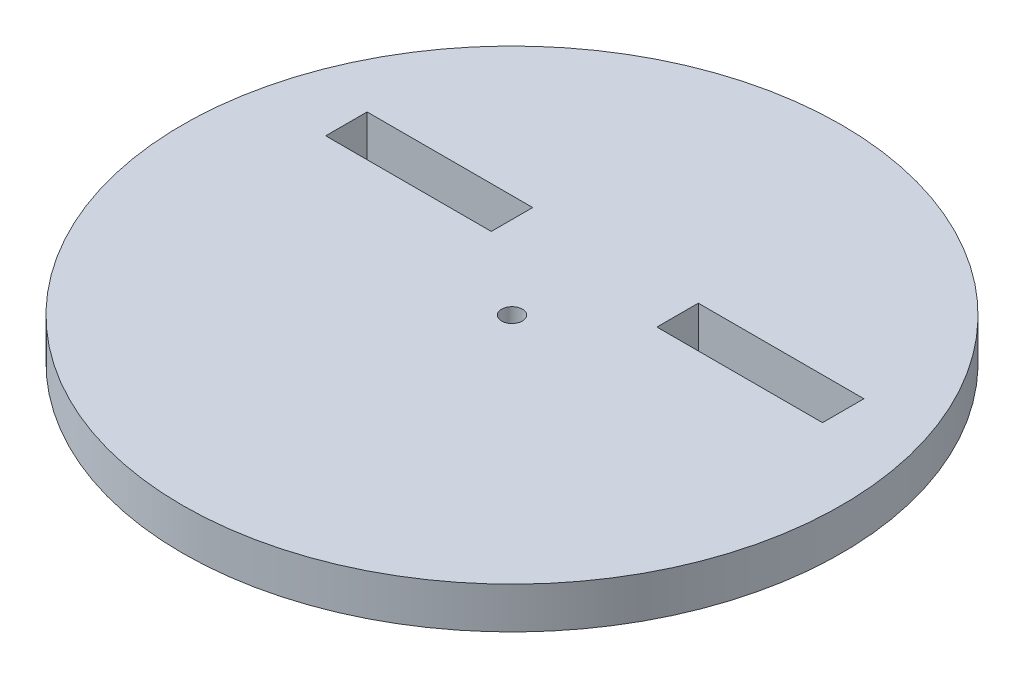
ISO-10303-21;
HEADER;
FILE_DESCRIPTION(('STEP AP214'),'2;1');
FILE_NAME('part.step','',(''),(''),'','','');
FILE_SCHEMA(('AUTOMOTIVE_DESIGN { 1 0 10303 214 1 1 1 1 }'));
ENDSEC;
DATA;
#1=APPLICATION_CONTEXT('core data for automotive mechanical design processes');
#2=APPLICATION_PROTOCOL_DEFINITION('international standard','automotive_design',2000,#1);
#3=PRODUCT_CONTEXT('',#1,'mechanical');
#4=PRODUCT('Part','Part','',(#3));
#5=PRODUCT_RELATED_PRODUCT_CATEGORY('part','',(#4));
#6=PRODUCT_DEFINITION_FORMATION('','',#4);
#7=PRODUCT_DEFINITION_CONTEXT('part definition',#1,'design');
#8=PRODUCT_DEFINITION('design','',#6,#7);
#9=PRODUCT_DEFINITION_SHAPE('','',#8);
#10=(LENGTH_UNIT() NAMED_UNIT(*) SI_UNIT(.MILLI.,.METRE.));
#11=(NAMED_UNIT(*) PLANE_ANGLE_UNIT() SI_UNIT($,.RADIAN.));
#12=(NAMED_UNIT(*) SI_UNIT($,.STERADIAN.) SOLID_ANGLE_UNIT());
#13=UNCERTAINTY_MEASURE_WITH_UNIT(LENGTH_MEASURE(1.E-05),#10,'distance_accuracy_value','');
#14=(GEOMETRIC_REPRESENTATION_CONTEXT(3) GLOBAL_UNCERTAINTY_ASSIGNED_CONTEXT((#13)) GLOBAL_UNIT_ASSIGNED_CONTEXT((#10,
#11,#12)) REPRESENTATION_CONTEXT('',''));
#15=CARTESIAN_POINT('',(0.,0.,0.));
#16=DIRECTION('',(0.,0.,1.));
#17=DIRECTION('',(1.,0.,0.));
#18=AXIS2_PLACEMENT_3D('',#15,#16,#17);
#19=CARTESIAN_POINT('',(0.,6.35,0.));
#20=DIRECTION('',(0.,1.,0.));
#21=DIRECTION('',(0.,0.,1.));
#22=AXIS2_PLACEMENT_3D('',#19,#20,#21);
#23=PLANE('',#22);
#24=CARTESIAN_POINT('',(0.,6.35,0.));
#25=DIRECTION('',(0.,1.,0.));
#26=DIRECTION('',(0.,0.,1.));
#27=AXIS2_PLACEMENT_3D('',#24,#25,#26);
#28=CIRCLE('',#27,50.546);
#29=CARTESIAN_POINT('',(0.,6.35,50.546));
#30=VERTEX_POINT('',#29);
#31=EDGE_CURVE('E11',#30,#30,#28,.T.);
#32=ORIENTED_EDGE('',*,*,#31,.T.);
#33=EDGE_LOOP('',(#32));
#34=FACE_BOUND('',#33,.T.);
#35=CARTESIAN_POINT('',(0.,6.35,0.));
#36=DIRECTION('',(0.,1.,0.));
#37=DIRECTION('',(0.,0.,1.));
#38=AXIS2_PLACEMENT_3D('',#35,#36,#37);
#39=CIRCLE('',#38,1.5875);
#40=CARTESIAN_POINT('',(0.,6.35,1.5875));
#41=VERTEX_POINT('',#40);
#42=EDGE_CURVE('E196',#41,#41,#39,.T.);
#43=ORIENTED_EDGE('',*,*,#42,.F.);
#44=EDGE_LOOP('',(#43));
#45=FACE_BOUND('',#44,.T.);
#46=DIRECTION('',(-1.,0.,0.));
#47=VECTOR('',#46,1.);
#48=CARTESIAN_POINT('',(-38.1,6.35,-15.875));
#49=LINE('',#48,#47);
#50=CARTESIAN_POINT('',(-12.7,6.35,-15.875));
#51=VERTEX_POINT('',#50);
#52=CARTESIAN_POINT('',(-38.1,6.35,-15.875));
#53=VERTEX_POINT('',#52);
#54=EDGE_CURVE('E156',#51,#53,#49,.T.);
#55=ORIENTED_EDGE('',*,*,#54,.F.);
#56=DIRECTION('',(0.,0.,-1.));
#57=VECTOR('',#56,1.);
#58=CARTESIAN_POINT('',(-12.7,6.35,-15.875));
#59=LINE('',#58,#57);
#60=CARTESIAN_POINT('',(-12.7,6.35,-9.525));
#61=VERTEX_POINT('',#60);
#62=EDGE_CURVE('E153',#61,#51,#59,.T.);
#63=ORIENTED_EDGE('',*,*,#62,.F.);
#64=DIRECTION('',(1.,0.,0.));
#65=VECTOR('',#64,1.);
#66=CARTESIAN_POINT('',(-38.1,6.35,-9.525));
#67=LINE('',#66,#65);
#68=CARTESIAN_POINT('',(-38.1,6.35,-9.525));
#69=VERTEX_POINT('',#68);
#70=EDGE_CURVE('E164',#69,#61,#67,.T.);
#71=ORIENTED_EDGE('',*,*,#70,.F.);
#72=DIRECTION('',(0.,0.,1.));
#73=VECTOR('',#72,1.);
#74=CARTESIAN_POINT('',(-38.1,6.35,-15.875));
#75=LINE('',#74,#73);
#76=EDGE_CURVE('E160',#53,#69,#75,.T.);
#77=ORIENTED_EDGE('',*,*,#76,.F.);
#78=EDGE_LOOP('',(#55,#63,#71,#77));
#79=FACE_BOUND('',#78,.T.);
#80=DIRECTION('',(0.,0.,1.));
#81=VECTOR('',#80,1.);
#82=CARTESIAN_POINT('',(12.7,6.35,-15.875));
#83=LINE('',#82,#81);
#84=CARTESIAN_POINT('',(12.7,6.35,-15.875));
#85=VERTEX_POINT('',#84);
#86=CARTESIAN_POINT('',(12.7,6.35,-9.525));
#87=VERTEX_POINT('',#86);
#88=EDGE_CURVE('E114',#85,#87,#83,.T.);
#89=ORIENTED_EDGE('',*,*,#88,.F.);
#90=DIRECTION('',(-1.,0.,0.));
#91=VECTOR('',#90,1.);
#92=CARTESIAN_POINT('',(38.1,6.35,-15.875));
#93=LINE('',#92,#91);
#94=CARTESIAN_POINT('',(38.1,6.35,-15.875));
#95=VERTEX_POINT('',#94);
#96=EDGE_CURVE('E105',#95,#85,#93,.T.);
#97=ORIENTED_EDGE('',*,*,#96,.F.);
#98=DIRECTION('',(0.,0.,-1.));
#99=VECTOR('',#98,1.);
#100=CARTESIAN_POINT('',(38.1,6.35,-15.875));
#101=LINE('',#100,#99);
#102=CARTESIAN_POINT('',(38.1,6.35,-9.525));
#103=VERTEX_POINT('',#102);
#104=EDGE_CURVE('E131',#103,#95,#101,.T.);
#105=ORIENTED_EDGE('',*,*,#104,.F.);
#106=DIRECTION('',(1.,0.,0.));
#107=VECTOR('',#106,1.);
#108=CARTESIAN_POINT('',(38.1,6.35,-9.525));
#109=LINE('',#108,#107);
#110=EDGE_CURVE('E127',#87,#103,#109,.T.);
#111=ORIENTED_EDGE('',*,*,#110,.F.);
#112=EDGE_LOOP('',(#89,#97,#105,#111));
#113=FACE_BOUND('',#112,.T.);
#114=ADVANCED_FACE('F39',(#34,#45,#79,#113),#23,.T.);
#115=CARTESIAN_POINT('',(0.,0.,0.));
#116=DIRECTION('',(0.,1.,0.));
#117=DIRECTION('',(0.,0.,1.));
#118=AXIS2_PLACEMENT_3D('',#115,#116,#117);
#119=PLANE('',#118);
#120=DIRECTION('',(0.,0.,-1.));
#121=VECTOR('',#120,1.);
#122=CARTESIAN_POINT('',(-12.7,0.,-15.875));
#123=LINE('',#122,#121);
#124=CARTESIAN_POINT('',(-12.7,0.,-9.525));
#125=VERTEX_POINT('',#124);
#126=CARTESIAN_POINT('',(-12.7,0.,-15.875));
#127=VERTEX_POINT('',#126);
#128=EDGE_CURVE('E123',#125,#127,#123,.T.);
#129=ORIENTED_EDGE('',*,*,#128,.T.);
#130=DIRECTION('',(-1.,0.,0.));
#131=VECTOR('',#130,1.);
#132=CARTESIAN_POINT('',(-38.1,0.,-15.875));
#133=LINE('',#132,#131);
#134=CARTESIAN_POINT('',(-38.1,0.,-15.875));
#135=VERTEX_POINT('',#134);
#136=EDGE_CURVE('E171',#127,#135,#133,.T.);
#137=ORIENTED_EDGE('',*,*,#136,.T.);
#138=DIRECTION('',(0.,0.,1.));
#139=VECTOR('',#138,1.);
#140=CARTESIAN_POINT('',(-38.1,0.,-15.875));
#141=LINE('',#140,#139);
#142=CARTESIAN_POINT('',(-38.1,0.,-9.525));
#143=VERTEX_POINT('',#142);
#144=EDGE_CURVE('E175',#135,#143,#141,.T.);
#145=ORIENTED_EDGE('',*,*,#144,.T.);
#146=DIRECTION('',(1.,0.,0.));
#147=VECTOR('',#146,1.);
#148=CARTESIAN_POINT('',(-38.1,0.,-9.525));
#149=LINE('',#148,#147);
#150=EDGE_CURVE('E157',#143,#125,#149,.T.);
#151=ORIENTED_EDGE('',*,*,#150,.T.);
#152=EDGE_LOOP('',(#129,#137,#145,#151));
#153=FACE_BOUND('',#152,.T.);
#154=CARTESIAN_POINT('',(0.,0.,0.));
#155=DIRECTION('',(0.,1.,0.));
#156=DIRECTION('',(0.,0.,1.));
#157=AXIS2_PLACEMENT_3D('',#154,#155,#156);
#158=CIRCLE('',#157,50.546);
#159=CARTESIAN_POINT('',(0.,0.,50.546));
#160=VERTEX_POINT('',#159);
#161=EDGE_CURVE('E43',#160,#160,#158,.T.);
#162=ORIENTED_EDGE('',*,*,#161,.F.);
#163=EDGE_LOOP('',(#162));
#164=FACE_BOUND('',#163,.T.);
#165=CARTESIAN_POINT('',(0.,0.,0.));
#166=DIRECTION('',(0.,1.,0.));
#167=DIRECTION('',(0.,0.,1.));
#168=AXIS2_PLACEMENT_3D('',#165,#166,#167);
#169=CIRCLE('',#168,1.5875);
#170=CARTESIAN_POINT('',(0.,0.,1.5875));
#171=VERTEX_POINT('',#170);
#172=EDGE_CURVE('E195',#171,#171,#169,.T.);
#173=ORIENTED_EDGE('',*,*,#172,.T.);
#174=EDGE_LOOP('',(#173));
#175=FACE_BOUND('',#174,.T.);
#176=DIRECTION('',(-1.,0.,0.));
#177=VECTOR('',#176,1.);
#178=CARTESIAN_POINT('',(38.1,0.,-15.875));
#179=LINE('',#178,#177);
#180=CARTESIAN_POINT('',(38.1,0.,-15.875));
#181=VERTEX_POINT('',#180);
#182=CARTESIAN_POINT('',(12.7,0.,-15.875));
#183=VERTEX_POINT('',#182);
#184=EDGE_CURVE('E63',#181,#183,#179,.T.);
#185=ORIENTED_EDGE('',*,*,#184,.T.);
#186=DIRECTION('',(0.,0.,1.));
#187=VECTOR('',#186,1.);
#188=CARTESIAN_POINT('',(12.7,0.,-15.875));
#189=LINE('',#188,#187);
#190=CARTESIAN_POINT('',(12.7,0.,-9.525));
#191=VERTEX_POINT('',#190);
#192=EDGE_CURVE('E121',#183,#191,#189,.T.);
#193=ORIENTED_EDGE('',*,*,#192,.T.);
#194=DIRECTION('',(1.,0.,0.));
#195=VECTOR('',#194,1.);
#196=CARTESIAN_POINT('',(38.1,0.,-9.525));
#197=LINE('',#196,#195);
#198=CARTESIAN_POINT('',(38.1,0.,-9.525));
#199=VERTEX_POINT('',#198);
#200=EDGE_CURVE('E140',#191,#199,#197,.T.);
#201=ORIENTED_EDGE('',*,*,#200,.T.);
#202=DIRECTION('',(0.,0.,-1.));
#203=VECTOR('',#202,1.);
#204=CARTESIAN_POINT('',(38.1,0.,-15.875));
#205=LINE('',#204,#203);
#206=EDGE_CURVE('E115',#199,#181,#205,.T.);
#207=ORIENTED_EDGE('',*,*,#206,.T.);
#208=EDGE_LOOP('',(#185,#193,#201,#207));
#209=FACE_BOUND('',#208,.T.);
#210=ADVANCED_FACE('F204',(#153,#164,#175,#209),#119,.F.);
#211=CARTESIAN_POINT('',(0.,6.35,0.));
#212=DIRECTION('',(0.,-1.,0.));
#213=DIRECTION('',(0.,0.,-1.));
#214=AXIS2_PLACEMENT_3D('',#211,#212,#213);
#215=CYLINDRICAL_SURFACE('',#214,50.546);
#216=ORIENTED_EDGE('',*,*,#31,.F.);
#217=EDGE_LOOP('',(#216));
#218=FACE_BOUND('',#217,.T.);
#219=ORIENTED_EDGE('',*,*,#161,.T.);
#220=EDGE_LOOP('',(#219));
#221=FACE_BOUND('',#220,.T.);
#222=ADVANCED_FACE('F41',(#218,#221),#215,.T.);
#223=CARTESIAN_POINT('',(0.,6.35,0.));
#224=DIRECTION('',(0.,-1.,0.));
#225=DIRECTION('',(0.,0.,-1.));
#226=AXIS2_PLACEMENT_3D('',#223,#224,#225);
#227=CYLINDRICAL_SURFACE('',#226,1.5875);
#228=ORIENTED_EDGE('',*,*,#42,.T.);
#229=EDGE_LOOP('',(#228));
#230=FACE_BOUND('',#229,.T.);
#231=ORIENTED_EDGE('',*,*,#172,.F.);
#232=EDGE_LOOP('',(#231));
#233=FACE_BOUND('',#232,.T.);
#234=ADVANCED_FACE('F207',(#230,#233),#227,.F.);
#235=CARTESIAN_POINT('',(-12.7,6.35,-15.875));
#236=DIRECTION('',(-1.,0.,0.));
#237=DIRECTION('',(0.,0.,1.));
#238=AXIS2_PLACEMENT_3D('',#235,#236,#237);
#239=PLANE('',#238);
#240=ORIENTED_EDGE('',*,*,#128,.F.);
#241=DIRECTION('',(0.,-1.,0.));
#242=VECTOR('',#241,1.);
#243=CARTESIAN_POINT('',(-12.7,6.35,-9.525));
#244=LINE('',#243,#242);
#245=EDGE_CURVE('E167',#61,#125,#244,.T.);
#246=ORIENTED_EDGE('',*,*,#245,.F.);
#247=ORIENTED_EDGE('',*,*,#62,.T.);
#248=DIRECTION('',(0.,-1.,0.));
#249=VECTOR('',#248,1.);
#250=CARTESIAN_POINT('',(-12.7,6.35,-15.875));
#251=LINE('',#250,#249);
#252=EDGE_CURVE('E191',#51,#127,#251,.T.);
#253=ORIENTED_EDGE('',*,*,#252,.T.);
#254=EDGE_LOOP('',(#240,#246,#247,#253));
#255=FACE_BOUND('',#254,.T.);
#256=ADVANCED_FACE('F209',(#255),#239,.T.);
#257=CARTESIAN_POINT('',(-38.1,6.35,-15.875));
#258=DIRECTION('',(0.,0.,1.));
#259=DIRECTION('',(1.,0.,0.));
#260=AXIS2_PLACEMENT_3D('',#257,#258,#259);
#261=PLANE('',#260);
#262=ORIENTED_EDGE('',*,*,#136,.F.);
#263=ORIENTED_EDGE('',*,*,#252,.F.);
#264=ORIENTED_EDGE('',*,*,#54,.T.);
#265=DIRECTION('',(0.,-1.,0.));
#266=VECTOR('',#265,1.);
#267=CARTESIAN_POINT('',(-38.1,6.35,-15.875));
#268=LINE('',#267,#266);
#269=EDGE_CURVE('E188',#53,#135,#268,.T.);
#270=ORIENTED_EDGE('',*,*,#269,.T.);
#271=EDGE_LOOP('',(#262,#263,#264,#270));
#272=FACE_BOUND('',#271,.T.);
#273=ADVANCED_FACE('F216',(#272),#261,.T.);
#274=CARTESIAN_POINT('',(-38.1,6.35,-15.875));
#275=DIRECTION('',(1.,0.,0.));
#276=DIRECTION('',(0.,0.,-1.));
#277=AXIS2_PLACEMENT_3D('',#274,#275,#276);
#278=PLANE('',#277);
#279=ORIENTED_EDGE('',*,*,#144,.F.);
#280=ORIENTED_EDGE('',*,*,#269,.F.);
#281=ORIENTED_EDGE('',*,*,#76,.T.);
#282=DIRECTION('',(0.,-1.,0.));
#283=VECTOR('',#282,1.);
#284=CARTESIAN_POINT('',(-38.1,6.35,-9.525));
#285=LINE('',#284,#283);
#286=EDGE_CURVE('E185',#69,#143,#285,.T.);
#287=ORIENTED_EDGE('',*,*,#286,.T.);
#288=EDGE_LOOP('',(#279,#280,#281,#287));
#289=FACE_BOUND('',#288,.T.);
#290=ADVANCED_FACE('F240',(#289),#278,.T.);
#291=CARTESIAN_POINT('',(-38.1,6.35,-9.525));
#292=DIRECTION('',(0.,0.,-1.));
#293=DIRECTION('',(-1.,0.,0.));
#294=AXIS2_PLACEMENT_3D('',#291,#292,#293);
#295=PLANE('',#294);
#296=ORIENTED_EDGE('',*,*,#150,.F.);
#297=ORIENTED_EDGE('',*,*,#286,.F.);
#298=ORIENTED_EDGE('',*,*,#70,.T.);
#299=ORIENTED_EDGE('',*,*,#245,.T.);
#300=EDGE_LOOP('',(#296,#297,#298,#299));
#301=FACE_BOUND('',#300,.T.);
#302=ADVANCED_FACE('F245',(#301),#295,.T.);
#303=CARTESIAN_POINT('',(38.1,6.35,-15.875));
#304=DIRECTION('',(0.,0.,1.));
#305=DIRECTION('',(1.,0.,0.));
#306=AXIS2_PLACEMENT_3D('',#303,#304,#305);
#307=PLANE('',#306);
#308=ORIENTED_EDGE('',*,*,#184,.F.);
#309=DIRECTION('',(0.,-1.,0.));
#310=VECTOR('',#309,1.);
#311=CARTESIAN_POINT('',(38.1,6.35,-15.875));
#312=LINE('',#311,#310);
#313=EDGE_CURVE('E109',#95,#181,#312,.T.);
#314=ORIENTED_EDGE('',*,*,#313,.F.);
#315=ORIENTED_EDGE('',*,*,#96,.T.);
#316=DIRECTION('',(0.,-1.,0.));
#317=VECTOR('',#316,1.);
#318=CARTESIAN_POINT('',(12.7,6.35,-15.875));
#319=LINE('',#318,#317);
#320=EDGE_CURVE('E108',#85,#183,#319,.T.);
#321=ORIENTED_EDGE('',*,*,#320,.T.);
#322=EDGE_LOOP('',(#308,#314,#315,#321));
#323=FACE_BOUND('',#322,.T.);
#324=ADVANCED_FACE('F107',(#323),#307,.T.);
#325=CARTESIAN_POINT('',(12.7,6.35,-15.875));
#326=DIRECTION('',(1.,0.,0.));
#327=DIRECTION('',(0.,0.,-1.));
#328=AXIS2_PLACEMENT_3D('',#325,#326,#327);
#329=PLANE('',#328);
#330=ORIENTED_EDGE('',*,*,#192,.F.);
#331=ORIENTED_EDGE('',*,*,#320,.F.);
#332=ORIENTED_EDGE('',*,*,#88,.T.);
#333=DIRECTION('',(0.,-1.,0.));
#334=VECTOR('',#333,1.);
#335=CARTESIAN_POINT('',(12.7,6.35,-9.525));
#336=LINE('',#335,#334);
#337=EDGE_CURVE('E124',#87,#191,#336,.T.);
#338=ORIENTED_EDGE('',*,*,#337,.T.);
#339=EDGE_LOOP('',(#330,#331,#332,#338));
#340=FACE_BOUND('',#339,.T.);
#341=ADVANCED_FACE('F118',(#340),#329,.T.);
#342=CARTESIAN_POINT('',(38.1,6.35,-9.525));
#343=DIRECTION('',(0.,0.,-1.));
#344=DIRECTION('',(-1.,0.,0.));
#345=AXIS2_PLACEMENT_3D('',#342,#343,#344);
#346=PLANE('',#345);
#347=ORIENTED_EDGE('',*,*,#200,.F.);
#348=ORIENTED_EDGE('',*,*,#337,.F.);
#349=ORIENTED_EDGE('',*,*,#110,.T.);
#350=DIRECTION('',(0.,-1.,0.));
#351=VECTOR('',#350,1.);
#352=CARTESIAN_POINT('',(38.1,6.35,-9.525));
#353=LINE('',#352,#351);
#354=EDGE_CURVE('E55',#103,#199,#353,.T.);
#355=ORIENTED_EDGE('',*,*,#354,.T.);
#356=EDGE_LOOP('',(#347,#348,#349,#355));
#357=FACE_BOUND('',#356,.T.);
#358=ADVANCED_FACE('F284',(#357),#346,.T.);
#359=CARTESIAN_POINT('',(38.1,6.35,-15.875));
#360=DIRECTION('',(-1.,0.,0.));
#361=DIRECTION('',(0.,0.,1.));
#362=AXIS2_PLACEMENT_3D('',#359,#360,#361);
#363=PLANE('',#362);
#364=ORIENTED_EDGE('',*,*,#206,.F.);
#365=ORIENTED_EDGE('',*,*,#354,.F.);
#366=ORIENTED_EDGE('',*,*,#104,.T.);
#367=ORIENTED_EDGE('',*,*,#313,.T.);
#368=EDGE_LOOP('',(#364,#365,#366,#367));
#369=FACE_BOUND('',#368,.T.);
#370=ADVANCED_FACE('F292',(#369),#363,.T.);
#371=CLOSED_SHELL('',(#114,#210,#222,#234,#256,#273,#290,#302,#324,#341,#358,#370));
#372=MANIFOLD_SOLID_BREP('B2',#371);
#373=ADVANCED_BREP_SHAPE_REPRESENTATION('',(#18,#372),#14);
#374=SHAPE_DEFINITION_REPRESENTATION(#9,#373);
ENDSEC;
END-ISO-10303-21;
